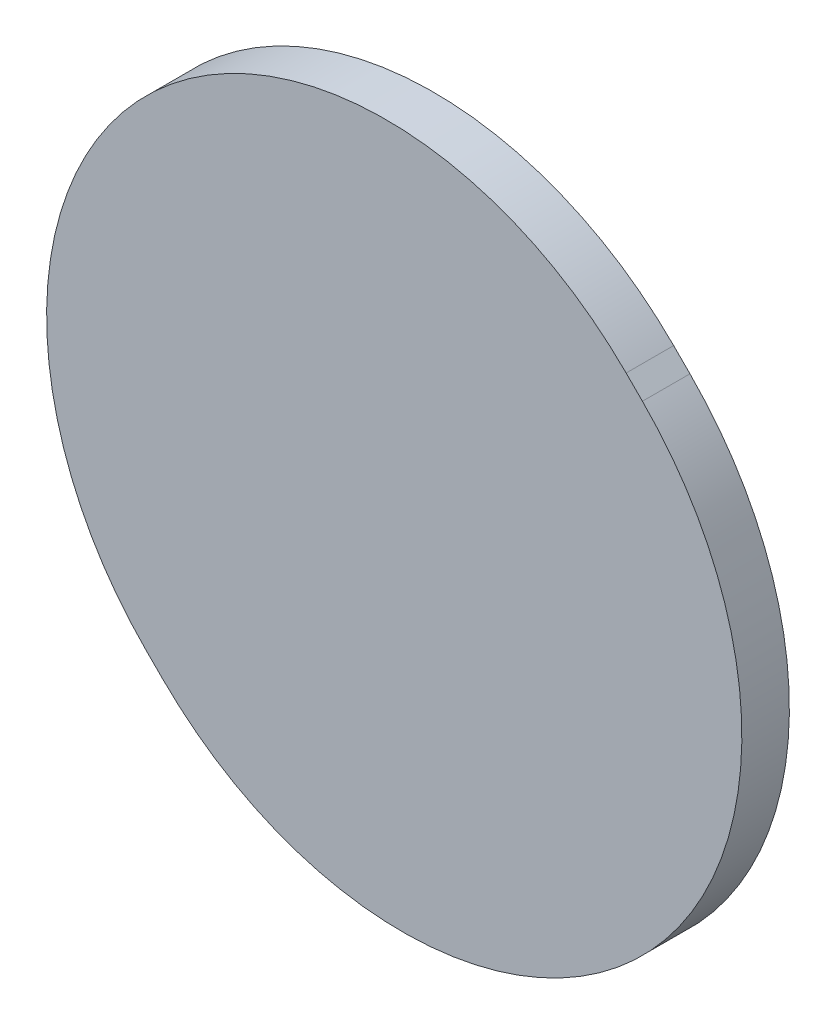
ISO-10303-21;
HEADER;
FILE_DESCRIPTION(('STEP AP214'),'2;1');
FILE_NAME('part.step','',(''),(''),'','','');
FILE_SCHEMA(('AUTOMOTIVE_DESIGN { 1 0 10303 214 1 1 1 1 }'));
ENDSEC;
DATA;
#1=APPLICATION_CONTEXT('core data for automotive mechanical design processes');
#2=APPLICATION_PROTOCOL_DEFINITION('international standard','automotive_design',2000,#1);
#3=PRODUCT_CONTEXT('',#1,'mechanical');
#4=PRODUCT('Part','Part','',(#3));
#5=PRODUCT_RELATED_PRODUCT_CATEGORY('part','',(#4));
#6=PRODUCT_DEFINITION_FORMATION('','',#4);
#7=PRODUCT_DEFINITION_CONTEXT('part definition',#1,'design');
#8=PRODUCT_DEFINITION('design','',#6,#7);
#9=PRODUCT_DEFINITION_SHAPE('','',#8);
#10=(LENGTH_UNIT() NAMED_UNIT(*) SI_UNIT(.MILLI.,.METRE.));
#11=(NAMED_UNIT(*) PLANE_ANGLE_UNIT() SI_UNIT($,.RADIAN.));
#12=(NAMED_UNIT(*) SI_UNIT($,.STERADIAN.) SOLID_ANGLE_UNIT());
#13=UNCERTAINTY_MEASURE_WITH_UNIT(LENGTH_MEASURE(1.E-05),#10,'distance_accuracy_value','');
#14=(GEOMETRIC_REPRESENTATION_CONTEXT(3) GLOBAL_UNCERTAINTY_ASSIGNED_CONTEXT((#13)) GLOBAL_UNIT_ASSIGNED_CONTEXT((#10,
#11,#12)) REPRESENTATION_CONTEXT('',''));
#15=CARTESIAN_POINT('',(0.,0.,0.));
#16=DIRECTION('',(0.,0.,1.));
#17=DIRECTION('',(1.,0.,0.));
#18=AXIS2_PLACEMENT_3D('',#15,#16,#17);
#19=CARTESIAN_POINT('',(128.618223,-110.465776,1.635));
#20=DIRECTION('',(0.,0.,1.));
#21=DIRECTION('',(1.,0.,0.));
#22=AXIS2_PLACEMENT_3D('',#19,#20,#21);
#23=PLANE('',#22);
#24=DIRECTION('',(0.707106781186548,-0.707106781186548,0.));
#25=VECTOR('',#24,1.);
#26=CARTESIAN_POINT('',(128.618223,-110.465776,1.635));
#27=LINE('',#26,#25);
#28=CARTESIAN_POINT('',(128.618223,-110.465776,1.635));
#29=VERTEX_POINT('',#28);
#30=CARTESIAN_POINT('',(128.630223,-110.477776,1.635));
#31=VERTEX_POINT('',#30);
#32=EDGE_CURVE('E95',#29,#31,#27,.T.);
#33=ORIENTED_EDGE('',*,*,#32,.T.);
#34=CARTESIAN_POINT('',(128.8069995,-110.3009995,1.635));
#35=DIRECTION('',(0.,0.,1.));
#36=DIRECTION('',(-0.707106781186548,-0.707106781186548,0.));
#37=AXIS2_PLACEMENT_3D('',#34,#35,#36);
#38=CIRCLE('',#37,0.249999723809);
#39=CARTESIAN_POINT('',(128.983776,-110.124223,1.635));
#40=VERTEX_POINT('',#39);
#41=EDGE_CURVE('E75',#31,#40,#38,.T.);
#42=ORIENTED_EDGE('',*,*,#41,.T.);
#43=DIRECTION('',(-0.707106781186548,0.707106781186548,0.));
#44=VECTOR('',#43,1.);
#45=CARTESIAN_POINT('',(128.983776,-110.124223,1.635));
#46=LINE('',#45,#44);
#47=CARTESIAN_POINT('',(128.971776,-110.112223,1.635));
#48=VERTEX_POINT('',#47);
#49=EDGE_CURVE('E21',#40,#48,#46,.T.);
#50=ORIENTED_EDGE('',*,*,#49,.T.);
#51=CARTESIAN_POINT('',(128.7949995,-110.2889995,1.635));
#52=DIRECTION('',(0.,0.,1.));
#53=DIRECTION('',(0.707106781186548,0.707106781186548,0.));
#54=AXIS2_PLACEMENT_3D('',#51,#52,#53);
#55=CIRCLE('',#54,0.249999723809);
#56=EDGE_CURVE('E11',#48,#29,#55,.T.);
#57=ORIENTED_EDGE('',*,*,#56,.T.);
#58=EDGE_LOOP('',(#33,#42,#50,#57));
#59=FACE_BOUND('',#58,.T.);
#60=ADVANCED_FACE('F17',(#59),#23,.T.);
#61=CARTESIAN_POINT('',(128.618223,-110.465776,1.6));
#62=DIRECTION('',(0.,0.,1.));
#63=DIRECTION('',(1.,0.,0.));
#64=AXIS2_PLACEMENT_3D('',#61,#62,#63);
#65=PLANE('',#64);
#66=CARTESIAN_POINT('',(128.7949995,-110.2889995,1.6));
#67=DIRECTION('',(0.,0.,1.));
#68=DIRECTION('',(0.707106781186548,0.707106781186548,0.));
#69=AXIS2_PLACEMENT_3D('',#66,#67,#68);
#70=CIRCLE('',#69,0.249999723809);
#71=CARTESIAN_POINT('',(128.971776,-110.112223,1.6));
#72=VERTEX_POINT('',#71);
#73=CARTESIAN_POINT('',(128.618223,-110.465776,1.6));
#74=VERTEX_POINT('',#73);
#75=EDGE_CURVE('E27',#72,#74,#70,.T.);
#76=ORIENTED_EDGE('',*,*,#75,.F.);
#77=DIRECTION('',(-0.707106781186548,0.707106781186548,0.));
#78=VECTOR('',#77,1.);
#79=CARTESIAN_POINT('',(128.983776,-110.124223,1.6));
#80=LINE('',#79,#78);
#81=CARTESIAN_POINT('',(128.983776,-110.124223,1.6));
#82=VERTEX_POINT('',#81);
#83=EDGE_CURVE('E60',#82,#72,#80,.T.);
#84=ORIENTED_EDGE('',*,*,#83,.F.);
#85=CARTESIAN_POINT('',(128.8069995,-110.3009995,1.6));
#86=DIRECTION('',(0.,0.,1.));
#87=DIRECTION('',(-0.707106781186548,-0.707106781186548,0.));
#88=AXIS2_PLACEMENT_3D('',#85,#86,#87);
#89=CIRCLE('',#88,0.249999723809);
#90=CARTESIAN_POINT('',(128.630223,-110.477776,1.6));
#91=VERTEX_POINT('',#90);
#92=EDGE_CURVE('E97',#91,#82,#89,.T.);
#93=ORIENTED_EDGE('',*,*,#92,.F.);
#94=DIRECTION('',(0.707106781186548,-0.707106781186548,0.));
#95=VECTOR('',#94,1.);
#96=CARTESIAN_POINT('',(128.618223,-110.465776,1.6));
#97=LINE('',#96,#95);
#98=EDGE_CURVE('E94',#74,#91,#97,.T.);
#99=ORIENTED_EDGE('',*,*,#98,.F.);
#100=EDGE_LOOP('',(#76,#84,#93,#99));
#101=FACE_BOUND('',#100,.T.);
#102=ADVANCED_FACE('F19',(#101),#65,.F.);
#103=CARTESIAN_POINT('',(128.7949995,-110.2889995,1.6));
#104=DIRECTION('',(0.,0.,-1.));
#105=DIRECTION('',(0.707106781186548,0.707106781186548,0.));
#106=AXIS2_PLACEMENT_3D('',#103,#104,#105);
#107=CYLINDRICAL_SURFACE('',#106,0.249999723809);
#108=ORIENTED_EDGE('',*,*,#75,.T.);
#109=DIRECTION('',(0.,0.,1.));
#110=VECTOR('',#109,1.);
#111=CARTESIAN_POINT('',(128.618223,-110.465776,1.6));
#112=LINE('',#111,#110);
#113=EDGE_CURVE('E84',#74,#29,#112,.T.);
#114=ORIENTED_EDGE('',*,*,#113,.T.);
#115=ORIENTED_EDGE('',*,*,#56,.F.);
#116=DIRECTION('',(0.,0.,1.));
#117=VECTOR('',#116,1.);
#118=CARTESIAN_POINT('',(128.971776,-110.112223,1.6));
#119=LINE('',#118,#117);
#120=EDGE_CURVE('E87',#72,#48,#119,.T.);
#121=ORIENTED_EDGE('',*,*,#120,.F.);
#122=EDGE_LOOP('',(#108,#114,#115,#121));
#123=FACE_BOUND('',#122,.T.);
#124=ADVANCED_FACE('F83',(#123),#107,.T.);
#125=CARTESIAN_POINT('',(128.983776,-110.124223,1.6));
#126=DIRECTION('',(-0.707106781186548,-0.707106781186548,0.));
#127=DIRECTION('',(-0.707106781186548,0.707106781186548,0.));
#128=AXIS2_PLACEMENT_3D('',#125,#126,#127);
#129=PLANE('',#128);
#130=ORIENTED_EDGE('',*,*,#83,.T.);
#131=ORIENTED_EDGE('',*,*,#120,.T.);
#132=ORIENTED_EDGE('',*,*,#49,.F.);
#133=DIRECTION('',(0.,0.,1.));
#134=VECTOR('',#133,1.);
#135=CARTESIAN_POINT('',(128.983776,-110.124223,1.6));
#136=LINE('',#135,#134);
#137=EDGE_CURVE('E112',#82,#40,#136,.T.);
#138=ORIENTED_EDGE('',*,*,#137,.F.);
#139=EDGE_LOOP('',(#130,#131,#132,#138));
#140=FACE_BOUND('',#139,.T.);
#141=ADVANCED_FACE('F126',(#140),#129,.F.);
#142=CARTESIAN_POINT('',(128.8069995,-110.3009995,1.6));
#143=DIRECTION('',(0.,0.,-1.));
#144=DIRECTION('',(-0.707106781186548,-0.707106781186548,0.));
#145=AXIS2_PLACEMENT_3D('',#142,#143,#144);
#146=CYLINDRICAL_SURFACE('',#145,0.249999723809);
#147=ORIENTED_EDGE('',*,*,#92,.T.);
#148=ORIENTED_EDGE('',*,*,#137,.T.);
#149=ORIENTED_EDGE('',*,*,#41,.F.);
#150=DIRECTION('',(0.,0.,1.));
#151=VECTOR('',#150,1.);
#152=CARTESIAN_POINT('',(128.630223,-110.477776,1.6));
#153=LINE('',#152,#151);
#154=EDGE_CURVE('E101',#91,#31,#153,.T.);
#155=ORIENTED_EDGE('',*,*,#154,.F.);
#156=EDGE_LOOP('',(#147,#148,#149,#155));
#157=FACE_BOUND('',#156,.T.);
#158=ADVANCED_FACE('F127',(#157),#146,.T.);
#159=CARTESIAN_POINT('',(128.618223,-110.465776,1.6));
#160=DIRECTION('',(0.707106781186548,0.707106781186548,0.));
#161=DIRECTION('',(0.,0.,-1.));
#162=AXIS2_PLACEMENT_3D('',#159,#160,#161);
#163=PLANE('',#162);
#164=ORIENTED_EDGE('',*,*,#98,.T.);
#165=ORIENTED_EDGE('',*,*,#154,.T.);
#166=ORIENTED_EDGE('',*,*,#32,.F.);
#167=ORIENTED_EDGE('',*,*,#113,.F.);
#168=EDGE_LOOP('',(#164,#165,#166,#167));
#169=FACE_BOUND('',#168,.T.);
#170=ADVANCED_FACE('F92',(#169),#163,.F.);
#171=CLOSED_SHELL('',(#60,#102,#124,#141,#158,#170));
#172=MANIFOLD_SOLID_BREP('B1',#171);
#173=ADVANCED_BREP_SHAPE_REPRESENTATION('',(#18,#172),#14);
#174=SHAPE_DEFINITION_REPRESENTATION(#9,#173);
ENDSEC;
END-ISO-10303-21;
